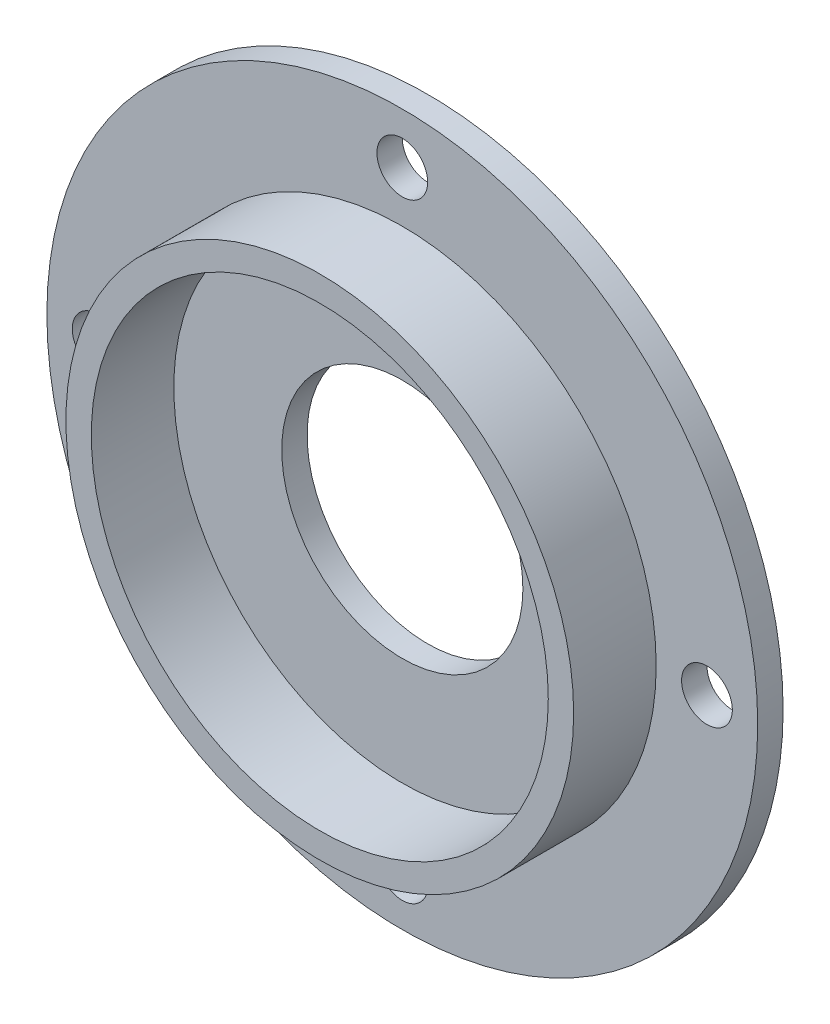
ISO-10303-21;
HEADER;
FILE_DESCRIPTION(('STEP AP214'),'2;1');
FILE_NAME('part.step','',(''),(''),'','','');
FILE_SCHEMA(('AUTOMOTIVE_DESIGN { 1 0 10303 214 1 1 1 1 }'));
ENDSEC;
DATA;
#1=APPLICATION_CONTEXT('core data for automotive mechanical design processes');
#2=APPLICATION_PROTOCOL_DEFINITION('international standard','automotive_design',2000,#1);
#3=PRODUCT_CONTEXT('',#1,'mechanical');
#4=PRODUCT('Part','Part','',(#3));
#5=PRODUCT_RELATED_PRODUCT_CATEGORY('part','',(#4));
#6=PRODUCT_DEFINITION_FORMATION('','',#4);
#7=PRODUCT_DEFINITION_CONTEXT('part definition',#1,'design');
#8=PRODUCT_DEFINITION('design','',#6,#7);
#9=PRODUCT_DEFINITION_SHAPE('','',#8);
#10=(LENGTH_UNIT() NAMED_UNIT(*) SI_UNIT(.MILLI.,.METRE.));
#11=(NAMED_UNIT(*) PLANE_ANGLE_UNIT() SI_UNIT($,.RADIAN.));
#12=(NAMED_UNIT(*) SI_UNIT($,.STERADIAN.) SOLID_ANGLE_UNIT());
#13=UNCERTAINTY_MEASURE_WITH_UNIT(LENGTH_MEASURE(1.E-05),#10,'distance_accuracy_value','');
#14=(GEOMETRIC_REPRESENTATION_CONTEXT(3) GLOBAL_UNCERTAINTY_ASSIGNED_CONTEXT((#13)) GLOBAL_UNIT_ASSIGNED_CONTEXT((#10,
#11,#12)) REPRESENTATION_CONTEXT('',''));
#15=CARTESIAN_POINT('',(0.,0.,0.));
#16=DIRECTION('',(0.,0.,1.));
#17=DIRECTION('',(1.,0.,0.));
#18=AXIS2_PLACEMENT_3D('',#15,#16,#17);
#19=CARTESIAN_POINT('',(0.,0.,10.));
#20=DIRECTION('',(0.,0.,1.));
#21=DIRECTION('',(1.,0.,0.));
#22=AXIS2_PLACEMENT_3D('',#19,#20,#21);
#23=PLANE('',#22);
#24=CARTESIAN_POINT('',(0.,-120.,10.));
#25=DIRECTION('',(0.,0.,1.));
#26=DIRECTION('',(1.,0.,0.));
#27=AXIS2_PLACEMENT_3D('',#24,#25,#26);
#28=CIRCLE('',#27,10.);
#29=CARTESIAN_POINT('',(10.,-120.,10.));
#30=VERTEX_POINT('',#29);
#31=EDGE_CURVE('E65',#30,#30,#28,.T.);
#32=ORIENTED_EDGE('',*,*,#31,.F.);
#33=EDGE_LOOP('',(#32));
#34=FACE_BOUND('',#33,.T.);
#35=CARTESIAN_POINT('',(0.,120.,10.));
#36=DIRECTION('',(0.,0.,1.));
#37=DIRECTION('',(1.,0.,0.));
#38=AXIS2_PLACEMENT_3D('',#35,#36,#37);
#39=CIRCLE('',#38,10.);
#40=CARTESIAN_POINT('',(10.,120.,10.));
#41=VERTEX_POINT('',#40);
#42=EDGE_CURVE('E53',#41,#41,#39,.T.);
#43=ORIENTED_EDGE('',*,*,#42,.F.);
#44=EDGE_LOOP('',(#43));
#45=FACE_BOUND('',#44,.T.);
#46=CARTESIAN_POINT('',(0.,0.,10.));
#47=DIRECTION('',(0.,0.,1.));
#48=DIRECTION('',(1.,0.,0.));
#49=AXIS2_PLACEMENT_3D('',#46,#47,#48);
#50=CIRCLE('',#49,140.);
#51=CARTESIAN_POINT('',(140.,0.,10.));
#52=VERTEX_POINT('',#51);
#53=EDGE_CURVE('E37',#52,#52,#50,.T.);
#54=ORIENTED_EDGE('',*,*,#53,.T.);
#55=EDGE_LOOP('',(#54));
#56=FACE_BOUND('',#55,.T.);
#57=CARTESIAN_POINT('',(120.,0.,10.));
#58=DIRECTION('',(0.,0.,1.));
#59=DIRECTION('',(1.,0.,0.));
#60=AXIS2_PLACEMENT_3D('',#57,#58,#59);
#61=CIRCLE('',#60,10.);
#62=CARTESIAN_POINT('',(130.,0.,10.));
#63=VERTEX_POINT('',#62);
#64=EDGE_CURVE('E59',#63,#63,#61,.T.);
#65=ORIENTED_EDGE('',*,*,#64,.F.);
#66=EDGE_LOOP('',(#65));
#67=FACE_BOUND('',#66,.T.);
#68=CARTESIAN_POINT('',(-120.,0.,10.));
#69=DIRECTION('',(0.,0.,1.));
#70=DIRECTION('',(1.,0.,0.));
#71=AXIS2_PLACEMENT_3D('',#68,#69,#70);
#72=CIRCLE('',#71,9.99999999999999);
#73=CARTESIAN_POINT('',(-110.,0.,10.));
#74=VERTEX_POINT('',#73);
#75=EDGE_CURVE('E71',#74,#74,#72,.T.);
#76=ORIENTED_EDGE('',*,*,#75,.F.);
#77=EDGE_LOOP('',(#76));
#78=FACE_BOUND('',#77,.T.);
#79=CARTESIAN_POINT('',(0.,0.,10.));
#80=DIRECTION('',(0.,0.,1.));
#81=DIRECTION('',(1.,0.,0.));
#82=AXIS2_PLACEMENT_3D('',#79,#80,#81);
#83=CIRCLE('',#82,100.);
#84=CARTESIAN_POINT('',(100.,0.,10.));
#85=VERTEX_POINT('',#84);
#86=EDGE_CURVE('E80',#85,#85,#83,.T.);
#87=ORIENTED_EDGE('',*,*,#86,.F.);
#88=EDGE_LOOP('',(#87));
#89=FACE_BOUND('',#88,.T.);
#90=ADVANCED_FACE('F30',(#34,#45,#56,#67,#78,#89),#23,.T.);
#91=CARTESIAN_POINT('',(0.,0.,10.));
#92=DIRECTION('',(0.,0.,1.));
#93=DIRECTION('',(1.,0.,0.));
#94=AXIS2_PLACEMENT_3D('',#91,#92,#93);
#95=CIRCLE('',#94,90.);
#96=CARTESIAN_POINT('',(90.,0.,10.));
#97=VERTEX_POINT('',#96);
#98=EDGE_CURVE('E10',#97,#97,#95,.F.);
#99=ORIENTED_EDGE('',*,*,#98,.F.);
#100=EDGE_LOOP('',(#99));
#101=FACE_BOUND('',#100,.T.);
#102=CARTESIAN_POINT('',(0.,0.,10.));
#103=DIRECTION('',(0.,0.,1.));
#104=DIRECTION('',(1.,0.,0.));
#105=AXIS2_PLACEMENT_3D('',#102,#103,#104);
#106=CIRCLE('',#105,47.5);
#107=CARTESIAN_POINT('',(47.5,0.,10.));
#108=VERTEX_POINT('',#107);
#109=EDGE_CURVE('E45',#108,#108,#106,.T.);
#110=ORIENTED_EDGE('',*,*,#109,.F.);
#111=EDGE_LOOP('',(#110));
#112=FACE_BOUND('',#111,.T.);
#113=ADVANCED_FACE('F106',(#101,#112),#23,.T.);
#114=CARTESIAN_POINT('',(0.,0.,0.));
#115=DIRECTION('',(0.,0.,1.));
#116=DIRECTION('',(1.,0.,0.));
#117=AXIS2_PLACEMENT_3D('',#114,#115,#116);
#118=PLANE('',#117);
#119=CARTESIAN_POINT('',(0.,-120.,0.));
#120=DIRECTION('',(0.,0.,1.));
#121=DIRECTION('',(1.,0.,0.));
#122=AXIS2_PLACEMENT_3D('',#119,#120,#121);
#123=CIRCLE('',#122,10.);
#124=CARTESIAN_POINT('',(10.,-120.,0.));
#125=VERTEX_POINT('',#124);
#126=EDGE_CURVE('E68',#125,#125,#123,.T.);
#127=ORIENTED_EDGE('',*,*,#126,.T.);
#128=EDGE_LOOP('',(#127));
#129=FACE_BOUND('',#128,.T.);
#130=CARTESIAN_POINT('',(0.,120.,0.));
#131=DIRECTION('',(0.,0.,1.));
#132=DIRECTION('',(1.,0.,0.));
#133=AXIS2_PLACEMENT_3D('',#130,#131,#132);
#134=CIRCLE('',#133,10.);
#135=CARTESIAN_POINT('',(10.,120.,0.));
#136=VERTEX_POINT('',#135);
#137=EDGE_CURVE('E56',#136,#136,#134,.T.);
#138=ORIENTED_EDGE('',*,*,#137,.T.);
#139=EDGE_LOOP('',(#138));
#140=FACE_BOUND('',#139,.T.);
#141=CARTESIAN_POINT('',(0.,0.,0.));
#142=DIRECTION('',(0.,0.,1.));
#143=DIRECTION('',(1.,0.,0.));
#144=AXIS2_PLACEMENT_3D('',#141,#142,#143);
#145=CIRCLE('',#144,140.);
#146=CARTESIAN_POINT('',(140.,0.,0.));
#147=VERTEX_POINT('',#146);
#148=EDGE_CURVE('E41',#147,#147,#145,.T.);
#149=ORIENTED_EDGE('',*,*,#148,.F.);
#150=EDGE_LOOP('',(#149));
#151=FACE_BOUND('',#150,.T.);
#152=CARTESIAN_POINT('',(0.,0.,0.));
#153=DIRECTION('',(0.,0.,1.));
#154=DIRECTION('',(1.,0.,0.));
#155=AXIS2_PLACEMENT_3D('',#152,#153,#154);
#156=CIRCLE('',#155,47.5);
#157=CARTESIAN_POINT('',(47.5,0.,0.));
#158=VERTEX_POINT('',#157);
#159=EDGE_CURVE('E50',#158,#158,#156,.T.);
#160=ORIENTED_EDGE('',*,*,#159,.T.);
#161=EDGE_LOOP('',(#160));
#162=FACE_BOUND('',#161,.T.);
#163=CARTESIAN_POINT('',(120.,0.,0.));
#164=DIRECTION('',(0.,0.,1.));
#165=DIRECTION('',(1.,0.,0.));
#166=AXIS2_PLACEMENT_3D('',#163,#164,#165);
#167=CIRCLE('',#166,10.);
#168=CARTESIAN_POINT('',(130.,0.,0.));
#169=VERTEX_POINT('',#168);
#170=EDGE_CURVE('E62',#169,#169,#167,.T.);
#171=ORIENTED_EDGE('',*,*,#170,.T.);
#172=EDGE_LOOP('',(#171));
#173=FACE_BOUND('',#172,.T.);
#174=CARTESIAN_POINT('',(-120.,0.,0.));
#175=DIRECTION('',(0.,0.,1.));
#176=DIRECTION('',(1.,0.,0.));
#177=AXIS2_PLACEMENT_3D('',#174,#175,#176);
#178=CIRCLE('',#177,9.99999999999999);
#179=CARTESIAN_POINT('',(-110.,0.,0.));
#180=VERTEX_POINT('',#179);
#181=EDGE_CURVE('E74',#180,#180,#178,.T.);
#182=ORIENTED_EDGE('',*,*,#181,.T.);
#183=EDGE_LOOP('',(#182));
#184=FACE_BOUND('',#183,.T.);
#185=ADVANCED_FACE('F111',(#129,#140,#151,#162,#173,#184),#118,.F.);
#186=CARTESIAN_POINT('',(0.,0.,10.));
#187=DIRECTION('',(0.,0.,-1.));
#188=DIRECTION('',(-1.,0.,0.));
#189=AXIS2_PLACEMENT_3D('',#186,#187,#188);
#190=CYLINDRICAL_SURFACE('',#189,140.);
#191=ORIENTED_EDGE('',*,*,#53,.F.);
#192=EDGE_LOOP('',(#191));
#193=FACE_BOUND('',#192,.T.);
#194=ORIENTED_EDGE('',*,*,#148,.T.);
#195=EDGE_LOOP('',(#194));
#196=FACE_BOUND('',#195,.T.);
#197=ADVANCED_FACE('F32',(#193,#196),#190,.T.);
#198=CARTESIAN_POINT('',(0.,0.,10.));
#199=DIRECTION('',(0.,0.,-1.));
#200=DIRECTION('',(-1.,0.,0.));
#201=AXIS2_PLACEMENT_3D('',#198,#199,#200);
#202=CYLINDRICAL_SURFACE('',#201,47.5);
#203=ORIENTED_EDGE('',*,*,#109,.T.);
#204=EDGE_LOOP('',(#203));
#205=FACE_BOUND('',#204,.T.);
#206=ORIENTED_EDGE('',*,*,#159,.F.);
#207=EDGE_LOOP('',(#206));
#208=FACE_BOUND('',#207,.T.);
#209=ADVANCED_FACE('F119',(#205,#208),#202,.F.);
#210=CARTESIAN_POINT('',(0.,120.,10.));
#211=DIRECTION('',(0.,0.,-1.));
#212=DIRECTION('',(-1.,0.,0.));
#213=AXIS2_PLACEMENT_3D('',#210,#211,#212);
#214=CYLINDRICAL_SURFACE('',#213,10.);
#215=ORIENTED_EDGE('',*,*,#42,.T.);
#216=EDGE_LOOP('',(#215));
#217=FACE_BOUND('',#216,.T.);
#218=ORIENTED_EDGE('',*,*,#137,.F.);
#219=EDGE_LOOP('',(#218));
#220=FACE_BOUND('',#219,.T.);
#221=ADVANCED_FACE('F122',(#217,#220),#214,.F.);
#222=CARTESIAN_POINT('',(120.,0.,10.));
#223=DIRECTION('',(0.,0.,-1.));
#224=DIRECTION('',(-1.,0.,0.));
#225=AXIS2_PLACEMENT_3D('',#222,#223,#224);
#226=CYLINDRICAL_SURFACE('',#225,10.);
#227=ORIENTED_EDGE('',*,*,#64,.T.);
#228=EDGE_LOOP('',(#227));
#229=FACE_BOUND('',#228,.T.);
#230=ORIENTED_EDGE('',*,*,#170,.F.);
#231=EDGE_LOOP('',(#230));
#232=FACE_BOUND('',#231,.T.);
#233=ADVANCED_FACE('F126',(#229,#232),#226,.F.);
#234=CARTESIAN_POINT('',(0.,-120.,10.));
#235=DIRECTION('',(0.,0.,-1.));
#236=DIRECTION('',(-1.,0.,0.));
#237=AXIS2_PLACEMENT_3D('',#234,#235,#236);
#238=CYLINDRICAL_SURFACE('',#237,10.);
#239=ORIENTED_EDGE('',*,*,#31,.T.);
#240=EDGE_LOOP('',(#239));
#241=FACE_BOUND('',#240,.T.);
#242=ORIENTED_EDGE('',*,*,#126,.F.);
#243=EDGE_LOOP('',(#242));
#244=FACE_BOUND('',#243,.T.);
#245=ADVANCED_FACE('F101',(#241,#244),#238,.F.);
#246=CARTESIAN_POINT('',(-120.,0.,10.));
#247=DIRECTION('',(0.,0.,-1.));
#248=DIRECTION('',(-1.,0.,0.));
#249=AXIS2_PLACEMENT_3D('',#246,#247,#248);
#250=CYLINDRICAL_SURFACE('',#249,9.99999999999999);
#251=ORIENTED_EDGE('',*,*,#75,.T.);
#252=EDGE_LOOP('',(#251));
#253=FACE_BOUND('',#252,.T.);
#254=ORIENTED_EDGE('',*,*,#181,.F.);
#255=EDGE_LOOP('',(#254));
#256=FACE_BOUND('',#255,.T.);
#257=ADVANCED_FACE('F92',(#253,#256),#250,.F.);
#258=CARTESIAN_POINT('',(0.,0.,42.5));
#259=DIRECTION('',(0.,0.,1.));
#260=DIRECTION('',(1.,0.,0.));
#261=AXIS2_PLACEMENT_3D('',#258,#259,#260);
#262=PLANE('',#261);
#263=CARTESIAN_POINT('',(0.,0.,42.5));
#264=DIRECTION('',(0.,0.,1.));
#265=DIRECTION('',(1.,0.,0.));
#266=AXIS2_PLACEMENT_3D('',#263,#264,#265);
#267=CIRCLE('',#266,100.);
#268=CARTESIAN_POINT('',(100.,0.,42.5));
#269=VERTEX_POINT('',#268);
#270=EDGE_CURVE('E77',#269,#269,#267,.T.);
#271=ORIENTED_EDGE('',*,*,#270,.T.);
#272=EDGE_LOOP('',(#271));
#273=FACE_BOUND('',#272,.T.);
#274=CARTESIAN_POINT('',(0.,0.,42.5));
#275=DIRECTION('',(0.,0.,1.));
#276=DIRECTION('',(1.,0.,0.));
#277=AXIS2_PLACEMENT_3D('',#274,#275,#276);
#278=CIRCLE('',#277,90.);
#279=CARTESIAN_POINT('',(90.,0.,42.5));
#280=VERTEX_POINT('',#279);
#281=EDGE_CURVE('E83',#280,#280,#278,.T.);
#282=ORIENTED_EDGE('',*,*,#281,.F.);
#283=EDGE_LOOP('',(#282));
#284=FACE_BOUND('',#283,.T.);
#285=ADVANCED_FACE('F89',(#273,#284),#262,.T.);
#286=CARTESIAN_POINT('',(0.,0.,42.5));
#287=DIRECTION('',(0.,0.,-1.));
#288=DIRECTION('',(-1.,0.,0.));
#289=AXIS2_PLACEMENT_3D('',#286,#287,#288);
#290=CYLINDRICAL_SURFACE('',#289,100.);
#291=ORIENTED_EDGE('',*,*,#270,.F.);
#292=EDGE_LOOP('',(#291));
#293=FACE_BOUND('',#292,.T.);
#294=ORIENTED_EDGE('',*,*,#86,.T.);
#295=EDGE_LOOP('',(#294));
#296=FACE_BOUND('',#295,.T.);
#297=ADVANCED_FACE('F91',(#293,#296),#290,.T.);
#298=CARTESIAN_POINT('',(0.,0.,42.5));
#299=DIRECTION('',(0.,0.,-1.));
#300=DIRECTION('',(-1.,0.,0.));
#301=AXIS2_PLACEMENT_3D('',#298,#299,#300);
#302=CYLINDRICAL_SURFACE('',#301,90.);
#303=ORIENTED_EDGE('',*,*,#281,.T.);
#304=EDGE_LOOP('',(#303));
#305=FACE_BOUND('',#304,.T.);
#306=ORIENTED_EDGE('',*,*,#98,.T.);
#307=EDGE_LOOP('',(#306));
#308=FACE_BOUND('',#307,.T.);
#309=ADVANCED_FACE('F87',(#305,#308),#302,.F.);
#310=CLOSED_SHELL('',(#90,#113,#185,#197,#209,#221,#233,#245,#257,#285,#297,#309));
#311=MANIFOLD_SOLID_BREP('B2',#310);
#312=ADVANCED_BREP_SHAPE_REPRESENTATION('',(#18,#311),#14);
#313=SHAPE_DEFINITION_REPRESENTATION(#9,#312);
ENDSEC;
END-ISO-10303-21;
